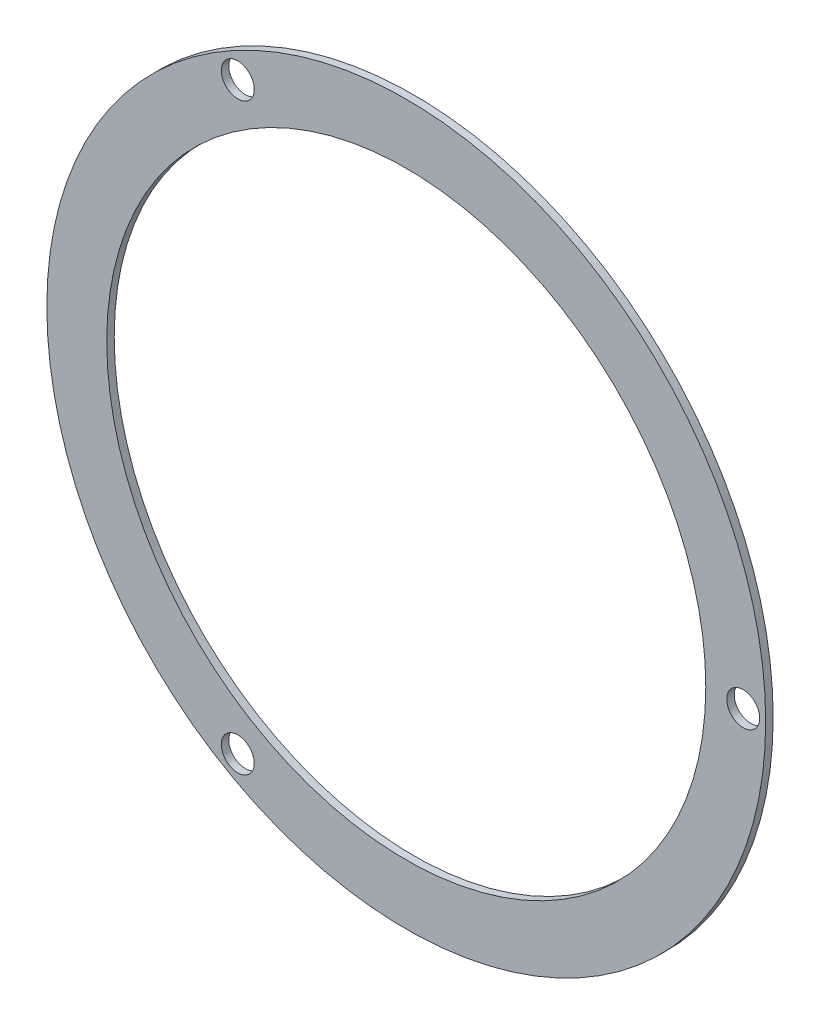
ISO-10303-21;
HEADER;
FILE_DESCRIPTION(('STEP AP214'),'2;1');
FILE_NAME('part.step','',(''),(''),'','','');
FILE_SCHEMA(('AUTOMOTIVE_DESIGN { 1 0 10303 214 1 1 1 1 }'));
ENDSEC;
DATA;
#1=APPLICATION_CONTEXT('core data for automotive mechanical design processes');
#2=APPLICATION_PROTOCOL_DEFINITION('international standard','automotive_design',2000,#1);
#3=PRODUCT_CONTEXT('',#1,'mechanical');
#4=PRODUCT('Part','Part','',(#3));
#5=PRODUCT_RELATED_PRODUCT_CATEGORY('part','',(#4));
#6=PRODUCT_DEFINITION_FORMATION('','',#4);
#7=PRODUCT_DEFINITION_CONTEXT('part definition',#1,'design');
#8=PRODUCT_DEFINITION('design','',#6,#7);
#9=PRODUCT_DEFINITION_SHAPE('','',#8);
#10=(LENGTH_UNIT() NAMED_UNIT(*) SI_UNIT(.MILLI.,.METRE.));
#11=(NAMED_UNIT(*) PLANE_ANGLE_UNIT() SI_UNIT($,.RADIAN.));
#12=(NAMED_UNIT(*) SI_UNIT($,.STERADIAN.) SOLID_ANGLE_UNIT());
#13=UNCERTAINTY_MEASURE_WITH_UNIT(LENGTH_MEASURE(1.E-05),#10,'distance_accuracy_value','');
#14=(GEOMETRIC_REPRESENTATION_CONTEXT(3) GLOBAL_UNCERTAINTY_ASSIGNED_CONTEXT((#13)) GLOBAL_UNIT_ASSIGNED_CONTEXT((#10,
#11,#12)) REPRESENTATION_CONTEXT('',''));
#15=CARTESIAN_POINT('',(0.,0.,0.));
#16=DIRECTION('',(0.,0.,1.));
#17=DIRECTION('',(1.,0.,0.));
#18=AXIS2_PLACEMENT_3D('',#15,#16,#17);
#19=CARTESIAN_POINT('',(0.,0.,0.5));
#20=DIRECTION('',(0.,0.,1.));
#21=DIRECTION('',(1.,0.,0.));
#22=AXIS2_PLACEMENT_3D('',#19,#20,#21);
#23=PLANE('',#22);
#24=CARTESIAN_POINT('',(22.5,0.,0.5));
#25=DIRECTION('',(0.,0.,1.));
#26=DIRECTION('',(1.,0.,0.));
#27=AXIS2_PLACEMENT_3D('',#24,#25,#26);
#28=CIRCLE('',#27,1.1);
#29=CARTESIAN_POINT('',(23.6,0.,0.5));
#30=VERTEX_POINT('',#29);
#31=EDGE_CURVE('E52',#30,#30,#28,.T.);
#32=ORIENTED_EDGE('',*,*,#31,.F.);
#33=EDGE_LOOP('',(#32));
#34=FACE_BOUND('',#33,.T.);
#35=CARTESIAN_POINT('',(-11.25,19.4855715851499,0.5));
#36=DIRECTION('',(0.,0.,1.));
#37=DIRECTION('',(1.,0.,0.));
#38=AXIS2_PLACEMENT_3D('',#35,#36,#37);
#39=CIRCLE('',#38,1.1);
#40=CARTESIAN_POINT('',(-10.15,19.4855715851499,0.5));
#41=VERTEX_POINT('',#40);
#42=EDGE_CURVE('E59',#41,#41,#39,.T.);
#43=ORIENTED_EDGE('',*,*,#42,.F.);
#44=EDGE_LOOP('',(#43));
#45=FACE_BOUND('',#44,.T.);
#46=CARTESIAN_POINT('',(-11.25,-19.4855715851499,0.5));
#47=DIRECTION('',(0.,0.,1.));
#48=DIRECTION('',(1.,0.,0.));
#49=AXIS2_PLACEMENT_3D('',#46,#47,#48);
#50=CIRCLE('',#49,1.1);
#51=CARTESIAN_POINT('',(-10.15,-19.4855715851499,0.5));
#52=VERTEX_POINT('',#51);
#53=EDGE_CURVE('E62',#52,#52,#50,.T.);
#54=ORIENTED_EDGE('',*,*,#53,.F.);
#55=EDGE_LOOP('',(#54));
#56=FACE_BOUND('',#55,.T.);
#57=CARTESIAN_POINT('',(0.,0.,0.5));
#58=DIRECTION('',(0.,0.,1.));
#59=DIRECTION('',(1.,0.,0.));
#60=AXIS2_PLACEMENT_3D('',#57,#58,#59);
#61=CIRCLE('',#60,24.);
#62=CARTESIAN_POINT('',(24.,0.,0.5));
#63=VERTEX_POINT('',#62);
#64=EDGE_CURVE('E10',#63,#63,#61,.T.);
#65=ORIENTED_EDGE('',*,*,#64,.T.);
#66=EDGE_LOOP('',(#65));
#67=FACE_BOUND('',#66,.T.);
#68=CARTESIAN_POINT('',(0.,0.,0.5));
#69=DIRECTION('',(0.,0.,1.));
#70=DIRECTION('',(1.,0.,0.));
#71=AXIS2_PLACEMENT_3D('',#68,#69,#70);
#72=CIRCLE('',#71,20.);
#73=CARTESIAN_POINT('',(20.,0.,0.5));
#74=VERTEX_POINT('',#73);
#75=EDGE_CURVE('E48',#74,#74,#72,.T.);
#76=ORIENTED_EDGE('',*,*,#75,.F.);
#77=EDGE_LOOP('',(#76));
#78=FACE_BOUND('',#77,.T.);
#79=ADVANCED_FACE('F40',(#34,#45,#56,#67,#78),#23,.T.);
#80=CARTESIAN_POINT('',(0.,0.,0.));
#81=DIRECTION('',(0.,0.,1.));
#82=DIRECTION('',(1.,0.,0.));
#83=AXIS2_PLACEMENT_3D('',#80,#81,#82);
#84=PLANE('',#83);
#85=CARTESIAN_POINT('',(22.5,0.,0.));
#86=DIRECTION('',(0.,0.,-1.));
#87=DIRECTION('',(-1.,0.,0.));
#88=AXIS2_PLACEMENT_3D('',#85,#86,#87);
#89=CIRCLE('',#88,1.1);
#90=CARTESIAN_POINT('',(21.4,0.,0.));
#91=VERTEX_POINT('',#90);
#92=EDGE_CURVE('E61',#91,#91,#89,.T.);
#93=ORIENTED_EDGE('',*,*,#92,.F.);
#94=EDGE_LOOP('',(#93));
#95=FACE_BOUND('',#94,.T.);
#96=CARTESIAN_POINT('',(-11.25,19.4855715851499,0.));
#97=DIRECTION('',(0.,0.,-1.));
#98=DIRECTION('',(-1.,0.,0.));
#99=AXIS2_PLACEMENT_3D('',#96,#97,#98);
#100=CIRCLE('',#99,1.1);
#101=CARTESIAN_POINT('',(-12.35,19.4855715851499,0.));
#102=VERTEX_POINT('',#101);
#103=EDGE_CURVE('E68',#102,#102,#100,.T.);
#104=ORIENTED_EDGE('',*,*,#103,.F.);
#105=EDGE_LOOP('',(#104));
#106=FACE_BOUND('',#105,.T.);
#107=CARTESIAN_POINT('',(-11.25,-19.4855715851499,0.));
#108=DIRECTION('',(0.,0.,-1.));
#109=DIRECTION('',(-1.,0.,0.));
#110=AXIS2_PLACEMENT_3D('',#107,#108,#109);
#111=CIRCLE('',#110,1.1);
#112=CARTESIAN_POINT('',(-12.35,-19.4855715851499,0.));
#113=VERTEX_POINT('',#112);
#114=EDGE_CURVE('E63',#113,#113,#111,.T.);
#115=ORIENTED_EDGE('',*,*,#114,.F.);
#116=EDGE_LOOP('',(#115));
#117=FACE_BOUND('',#116,.T.);
#118=CARTESIAN_POINT('',(0.,0.,0.));
#119=DIRECTION('',(0.,0.,1.));
#120=DIRECTION('',(1.,0.,0.));
#121=AXIS2_PLACEMENT_3D('',#118,#119,#120);
#122=CIRCLE('',#121,24.);
#123=CARTESIAN_POINT('',(24.,0.,0.));
#124=VERTEX_POINT('',#123);
#125=EDGE_CURVE('E41',#124,#124,#122,.T.);
#126=ORIENTED_EDGE('',*,*,#125,.F.);
#127=EDGE_LOOP('',(#126));
#128=FACE_BOUND('',#127,.T.);
#129=CARTESIAN_POINT('',(0.,0.,0.));
#130=DIRECTION('',(0.,0.,1.));
#131=DIRECTION('',(1.,0.,0.));
#132=AXIS2_PLACEMENT_3D('',#129,#130,#131);
#133=CIRCLE('',#132,20.);
#134=CARTESIAN_POINT('',(20.,0.,0.));
#135=VERTEX_POINT('',#134);
#136=EDGE_CURVE('E49',#135,#135,#133,.T.);
#137=ORIENTED_EDGE('',*,*,#136,.T.);
#138=EDGE_LOOP('',(#137));
#139=FACE_BOUND('',#138,.T.);
#140=ADVANCED_FACE('F77',(#95,#106,#117,#128,#139),#84,.F.);
#141=CARTESIAN_POINT('',(0.,0.,0.5));
#142=DIRECTION('',(0.,0.,-1.));
#143=DIRECTION('',(-1.,0.,0.));
#144=AXIS2_PLACEMENT_3D('',#141,#142,#143);
#145=CYLINDRICAL_SURFACE('',#144,24.);
#146=ORIENTED_EDGE('',*,*,#64,.F.);
#147=EDGE_LOOP('',(#146));
#148=FACE_BOUND('',#147,.T.);
#149=ORIENTED_EDGE('',*,*,#125,.T.);
#150=EDGE_LOOP('',(#149));
#151=FACE_BOUND('',#150,.T.);
#152=ADVANCED_FACE('F39',(#148,#151),#145,.T.);
#153=CARTESIAN_POINT('',(0.,0.,0.5));
#154=DIRECTION('',(0.,0.,-1.));
#155=DIRECTION('',(-1.,0.,0.));
#156=AXIS2_PLACEMENT_3D('',#153,#154,#155);
#157=CYLINDRICAL_SURFACE('',#156,20.);
#158=ORIENTED_EDGE('',*,*,#75,.T.);
#159=EDGE_LOOP('',(#158));
#160=FACE_BOUND('',#159,.T.);
#161=ORIENTED_EDGE('',*,*,#136,.F.);
#162=EDGE_LOOP('',(#161));
#163=FACE_BOUND('',#162,.T.);
#164=ADVANCED_FACE('F90',(#160,#163),#157,.F.);
#165=CARTESIAN_POINT('',(-11.25,-19.4855715851499,0.51));
#166=DIRECTION('',(0.,0.,-1.));
#167=DIRECTION('',(-1.,0.,0.));
#168=AXIS2_PLACEMENT_3D('',#165,#166,#167);
#169=CYLINDRICAL_SURFACE('',#168,1.1);
#170=ORIENTED_EDGE('',*,*,#53,.T.);
#171=EDGE_LOOP('',(#170));
#172=FACE_BOUND('',#171,.T.);
#173=ORIENTED_EDGE('',*,*,#114,.T.);
#174=EDGE_LOOP('',(#173));
#175=FACE_BOUND('',#174,.T.);
#176=ADVANCED_FACE('F86',(#172,#175),#169,.F.);
#177=CARTESIAN_POINT('',(-11.25,19.4855715851499,0.51));
#178=DIRECTION('',(0.,0.,-1.));
#179=DIRECTION('',(-1.,0.,0.));
#180=AXIS2_PLACEMENT_3D('',#177,#178,#179);
#181=CYLINDRICAL_SURFACE('',#180,1.1);
#182=ORIENTED_EDGE('',*,*,#42,.T.);
#183=EDGE_LOOP('',(#182));
#184=FACE_BOUND('',#183,.T.);
#185=ORIENTED_EDGE('',*,*,#103,.T.);
#186=EDGE_LOOP('',(#185));
#187=FACE_BOUND('',#186,.T.);
#188=ADVANCED_FACE('F100',(#184,#187),#181,.F.);
#189=CARTESIAN_POINT('',(22.5,0.,0.51));
#190=DIRECTION('',(0.,0.,-1.));
#191=DIRECTION('',(-1.,0.,0.));
#192=AXIS2_PLACEMENT_3D('',#189,#190,#191);
#193=CYLINDRICAL_SURFACE('',#192,1.1);
#194=ORIENTED_EDGE('',*,*,#31,.T.);
#195=EDGE_LOOP('',(#194));
#196=FACE_BOUND('',#195,.T.);
#197=ORIENTED_EDGE('',*,*,#92,.T.);
#198=EDGE_LOOP('',(#197));
#199=FACE_BOUND('',#198,.T.);
#200=ADVANCED_FACE('F71',(#196,#199),#193,.F.);
#201=CLOSED_SHELL('',(#79,#140,#152,#164,#176,#188,#200));
#202=MANIFOLD_SOLID_BREP('B2',#201);
#203=ADVANCED_BREP_SHAPE_REPRESENTATION('',(#18,#202),#14);
#204=SHAPE_DEFINITION_REPRESENTATION(#9,#203);
ENDSEC;
END-ISO-10303-21;
